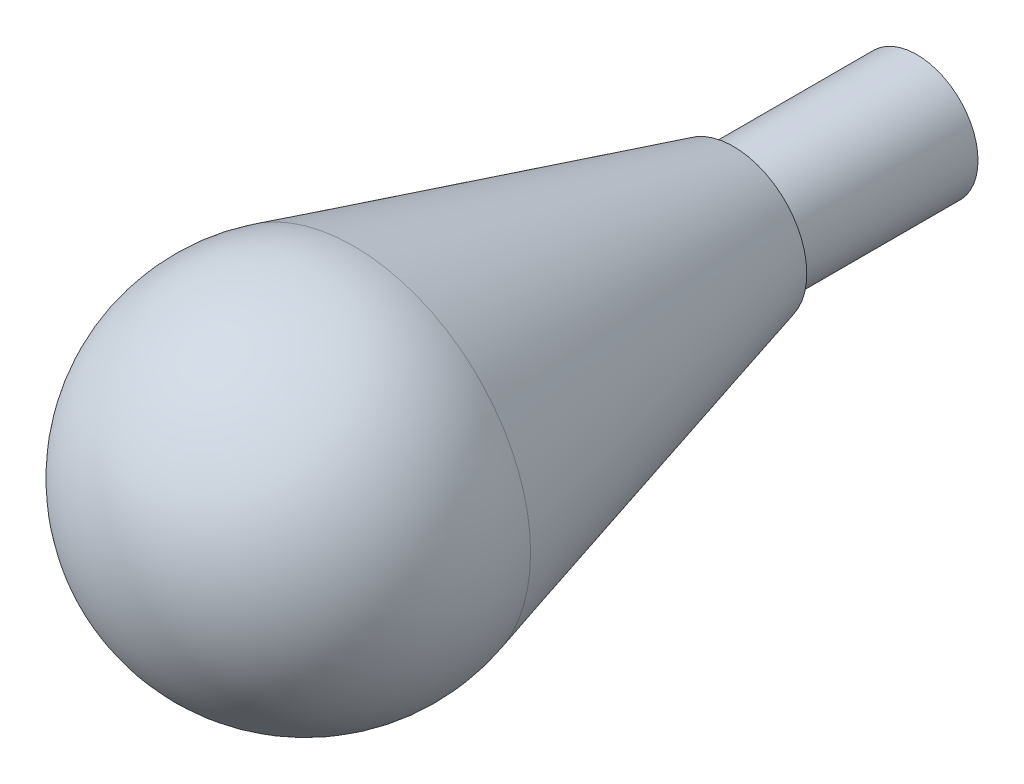
ISO-10303-21;
HEADER;
FILE_DESCRIPTION(('STEP AP214'),'2;1');
FILE_NAME('part.step','',(''),(''),'','','');
FILE_SCHEMA(('AUTOMOTIVE_DESIGN { 1 0 10303 214 1 1 1 1 }'));
ENDSEC;
DATA;
#1=APPLICATION_CONTEXT('core data for automotive mechanical design processes');
#2=APPLICATION_PROTOCOL_DEFINITION('international standard','automotive_design',2000,#1);
#3=PRODUCT_CONTEXT('',#1,'mechanical');
#4=PRODUCT('Part','Part','',(#3));
#5=PRODUCT_RELATED_PRODUCT_CATEGORY('part','',(#4));
#6=PRODUCT_DEFINITION_FORMATION('','',#4);
#7=PRODUCT_DEFINITION_CONTEXT('part definition',#1,'design');
#8=PRODUCT_DEFINITION('design','',#6,#7);
#9=PRODUCT_DEFINITION_SHAPE('','',#8);
#10=(LENGTH_UNIT() NAMED_UNIT(*) SI_UNIT(.MILLI.,.METRE.));
#11=(NAMED_UNIT(*) PLANE_ANGLE_UNIT() SI_UNIT($,.RADIAN.));
#12=(NAMED_UNIT(*) SI_UNIT($,.STERADIAN.) SOLID_ANGLE_UNIT());
#13=UNCERTAINTY_MEASURE_WITH_UNIT(LENGTH_MEASURE(1.E-05),#10,'distance_accuracy_value','');
#14=(GEOMETRIC_REPRESENTATION_CONTEXT(3) GLOBAL_UNCERTAINTY_ASSIGNED_CONTEXT((#13)) GLOBAL_UNIT_ASSIGNED_CONTEXT((#10,
#11,#12)) REPRESENTATION_CONTEXT('',''));
#15=CARTESIAN_POINT('',(0.,0.,0.));
#16=DIRECTION('',(0.,0.,1.));
#17=DIRECTION('',(1.,0.,0.));
#18=AXIS2_PLACEMENT_3D('',#15,#16,#17);
#19=CARTESIAN_POINT('',(0.,0.,15.));
#20=DIRECTION('',(0.,0.,-1.));
#21=DIRECTION('',(-1.,0.,0.));
#22=AXIS2_PLACEMENT_3D('',#19,#20,#21);
#23=CYLINDRICAL_SURFACE('',#22,5.);
#24=CARTESIAN_POINT('',(0.,0.,15.));
#25=DIRECTION('',(0.,0.,1.));
#26=DIRECTION('',(1.,0.,0.));
#27=AXIS2_PLACEMENT_3D('',#24,#25,#26);
#28=CIRCLE('',#27,5.);
#29=CARTESIAN_POINT('',(5.,0.,15.));
#30=VERTEX_POINT('',#29);
#31=EDGE_CURVE('E10',#30,#30,#28,.T.);
#32=ORIENTED_EDGE('',*,*,#31,.F.);
#33=EDGE_LOOP('',(#32));
#34=FACE_BOUND('',#33,.T.);
#35=CARTESIAN_POINT('',(0.,0.,0.));
#36=DIRECTION('',(0.,0.,1.));
#37=DIRECTION('',(1.,0.,0.));
#38=AXIS2_PLACEMENT_3D('',#35,#36,#37);
#39=CIRCLE('',#38,5.);
#40=CARTESIAN_POINT('',(5.,0.,0.));
#41=VERTEX_POINT('',#40);
#42=EDGE_CURVE('E40',#41,#41,#39,.T.);
#43=ORIENTED_EDGE('',*,*,#42,.T.);
#44=EDGE_LOOP('',(#43));
#45=FACE_BOUND('',#44,.T.);
#46=ADVANCED_FACE('F37',(#34,#45),#23,.T.);
#47=CARTESIAN_POINT('',(0.,0.,0.));
#48=DIRECTION('',(0.,0.,1.));
#49=DIRECTION('',(1.,0.,0.));
#50=AXIS2_PLACEMENT_3D('',#47,#48,#49);
#51=PLANE('',#50);
#52=ORIENTED_EDGE('',*,*,#42,.F.);
#53=EDGE_LOOP('',(#52));
#54=FACE_BOUND('',#53,.T.);
#55=ADVANCED_FACE('F73',(#54),#51,.F.);
#56=CARTESIAN_POINT('',(0.,0.,50.));
#57=DIRECTION('',(0.,0.,1.));
#58=DIRECTION('',(0.,1.,0.));
#59=AXIS2_PLACEMENT_3D('',#56,#57,#58);
#60=SPHERICAL_SURFACE('',#59,15.);
#61=CARTESIAN_POINT('',(0.,0.,46.0522013077697));
#62=DIRECTION('',(0.,0.,1.));
#63=DIRECTION('',(1.,0.,0.));
#64=AXIS2_PLACEMENT_3D('',#61,#62,#63);
#65=CIRCLE('',#64,14.4711742953233);
#66=CARTESIAN_POINT('',(14.4711742953233,0.,46.0522013077697));
#67=VERTEX_POINT('',#66);
#68=EDGE_CURVE('E54',#67,#67,#65,.T.);
#69=ORIENTED_EDGE('',*,*,#68,.T.);
#70=EDGE_LOOP('',(#69));
#71=FACE_BOUND('',#70,.T.);
#72=ADVANCED_FACE('F59',(#71),#60,.T.);
#73=CARTESIAN_POINT('',(0.,6.,15.));
#74=DIRECTION('',(0.,0.,1.));
#75=DIRECTION('',(1.,0.,0.));
#76=AXIS2_PLACEMENT_3D('',#73,#74,#75);
#77=PLANE('',#76);
#78=ORIENTED_EDGE('',*,*,#31,.T.);
#79=EDGE_LOOP('',(#78));
#80=FACE_BOUND('',#79,.T.);
#81=CARTESIAN_POINT('',(0.,0.,15.));
#82=DIRECTION('',(0.,0.,1.));
#83=DIRECTION('',(1.,0.,0.));
#84=AXIS2_PLACEMENT_3D('',#81,#82,#83);
#85=CIRCLE('',#84,6.);
#86=CARTESIAN_POINT('',(6.,0.,15.));
#87=VERTEX_POINT('',#86);
#88=EDGE_CURVE('E49',#87,#87,#85,.T.);
#89=ORIENTED_EDGE('',*,*,#88,.F.);
#90=EDGE_LOOP('',(#89));
#91=FACE_BOUND('',#90,.T.);
#92=ADVANCED_FACE('F64',(#80,#91),#77,.F.);
#93=CARTESIAN_POINT('',(0.,0.,15.));
#94=DIRECTION('',(0.,0.,1.));
#95=DIRECTION('',(1.,0.,0.));
#96=AXIS2_PLACEMENT_3D('',#93,#94,#95);
#97=CONICAL_SURFACE('',#96,6.,0.266323749980488);
#98=ORIENTED_EDGE('',*,*,#68,.F.);
#99=EDGE_LOOP('',(#98));
#100=FACE_BOUND('',#99,.T.);
#101=ORIENTED_EDGE('',*,*,#88,.T.);
#102=EDGE_LOOP('',(#101));
#103=FACE_BOUND('',#102,.T.);
#104=ADVANCED_FACE('F61',(#100,#103),#97,.T.);
#105=CLOSED_SHELL('',(#46,#55,#72,#92,#104));
#106=MANIFOLD_SOLID_BREP('B2',#105);
#107=ADVANCED_BREP_SHAPE_REPRESENTATION('',(#18,#106),#14);
#108=SHAPE_DEFINITION_REPRESENTATION(#9,#107);
ENDSEC;
END-ISO-10303-21;
